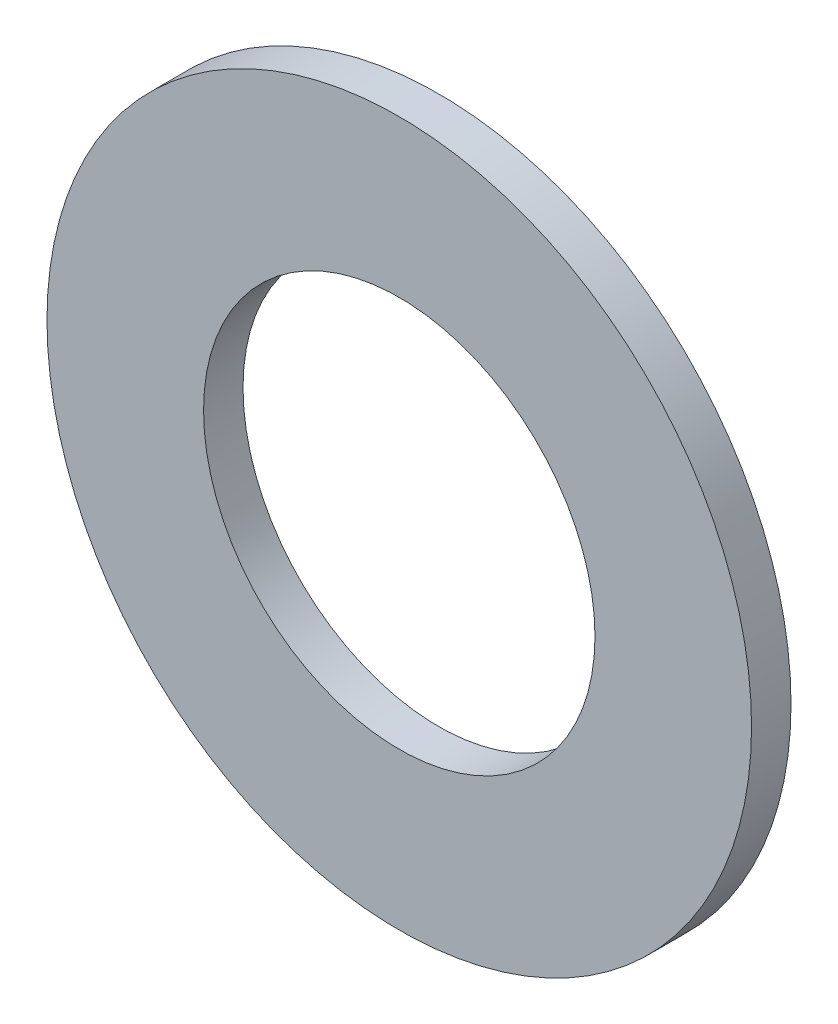
ISO-10303-21;
HEADER;
FILE_DESCRIPTION(('STEP AP214'),'2;1');
FILE_NAME('part.step','',(''),(''),'','','');
FILE_SCHEMA(('AUTOMOTIVE_DESIGN { 1 0 10303 214 1 1 1 1 }'));
ENDSEC;
DATA;
#1=APPLICATION_CONTEXT('core data for automotive mechanical design processes');
#2=APPLICATION_PROTOCOL_DEFINITION('international standard','automotive_design',2000,#1);
#3=PRODUCT_CONTEXT('',#1,'mechanical');
#4=PRODUCT('Part','Part','',(#3));
#5=PRODUCT_RELATED_PRODUCT_CATEGORY('part','',(#4));
#6=PRODUCT_DEFINITION_FORMATION('','',#4);
#7=PRODUCT_DEFINITION_CONTEXT('part definition',#1,'design');
#8=PRODUCT_DEFINITION('design','',#6,#7);
#9=PRODUCT_DEFINITION_SHAPE('','',#8);
#10=(LENGTH_UNIT() NAMED_UNIT(*) SI_UNIT(.MILLI.,.METRE.));
#11=(NAMED_UNIT(*) PLANE_ANGLE_UNIT() SI_UNIT($,.RADIAN.));
#12=(NAMED_UNIT(*) SI_UNIT($,.STERADIAN.) SOLID_ANGLE_UNIT());
#13=UNCERTAINTY_MEASURE_WITH_UNIT(LENGTH_MEASURE(1.E-05),#10,'distance_accuracy_value','');
#14=(GEOMETRIC_REPRESENTATION_CONTEXT(3) GLOBAL_UNCERTAINTY_ASSIGNED_CONTEXT((#13)) GLOBAL_UNIT_ASSIGNED_CONTEXT((#10,
#11,#12)) REPRESENTATION_CONTEXT('',''));
#15=CARTESIAN_POINT('',(0.,0.,0.));
#16=DIRECTION('',(0.,0.,1.));
#17=DIRECTION('',(1.,0.,0.));
#18=AXIS2_PLACEMENT_3D('',#15,#16,#17);
#19=CARTESIAN_POINT('',(0.,0.,-0.800100000000001));
#20=DIRECTION('',(0.,0.,1.));
#21=DIRECTION('',(1.,0.,0.));
#22=AXIS2_PLACEMENT_3D('',#19,#20,#21);
#23=CYLINDRICAL_SURFACE('',#22,14.2875);
#24=CARTESIAN_POINT('',(0.,0.,-0.800100000000001));
#25=DIRECTION('',(0.,0.,1.));
#26=DIRECTION('',(1.,0.,0.));
#27=AXIS2_PLACEMENT_3D('',#24,#25,#26);
#28=CIRCLE('',#27,14.2875);
#29=CARTESIAN_POINT('',(14.2875,0.,-0.800100000000001));
#30=VERTEX_POINT('',#29);
#31=EDGE_CURVE('E10',#30,#30,#28,.T.);
#32=ORIENTED_EDGE('',*,*,#31,.T.);
#33=EDGE_LOOP('',(#32));
#34=FACE_BOUND('',#33,.T.);
#35=CARTESIAN_POINT('',(0.,0.,0.800099999999999));
#36=DIRECTION('',(0.,0.,1.));
#37=DIRECTION('',(1.,0.,0.));
#38=AXIS2_PLACEMENT_3D('',#35,#36,#37);
#39=CIRCLE('',#38,14.2875);
#40=CARTESIAN_POINT('',(14.2875,0.,0.800099999999999));
#41=VERTEX_POINT('',#40);
#42=EDGE_CURVE('E53',#41,#41,#39,.T.);
#43=ORIENTED_EDGE('',*,*,#42,.F.);
#44=EDGE_LOOP('',(#43));
#45=FACE_BOUND('',#44,.T.);
#46=ADVANCED_FACE('F41',(#34,#45),#23,.T.);
#47=CARTESIAN_POINT('',(0.,0.,-0.800100000000001));
#48=DIRECTION('',(0.,0.,1.));
#49=DIRECTION('',(1.,0.,0.));
#50=AXIS2_PLACEMENT_3D('',#47,#48,#49);
#51=PLANE('',#50);
#52=CARTESIAN_POINT('',(0.,0.,-0.800100000000001));
#53=DIRECTION('',(0.,0.,1.));
#54=DIRECTION('',(1.,0.,0.));
#55=AXIS2_PLACEMENT_3D('',#52,#53,#54);
#56=CIRCLE('',#55,7.9375);
#57=CARTESIAN_POINT('',(7.9375,0.,-0.800100000000001));
#58=VERTEX_POINT('',#57);
#59=EDGE_CURVE('E48',#58,#58,#56,.T.);
#60=ORIENTED_EDGE('',*,*,#59,.T.);
#61=EDGE_LOOP('',(#60));
#62=FACE_BOUND('',#61,.T.);
#63=ORIENTED_EDGE('',*,*,#31,.F.);
#64=EDGE_LOOP('',(#63));
#65=FACE_BOUND('',#64,.T.);
#66=ADVANCED_FACE('F74',(#62,#65),#51,.F.);
#67=CARTESIAN_POINT('',(0.,0.,-0.800100000000001));
#68=DIRECTION('',(0.,0.,1.));
#69=DIRECTION('',(1.,0.,0.));
#70=AXIS2_PLACEMENT_3D('',#67,#68,#69);
#71=CYLINDRICAL_SURFACE('',#70,7.9375);
#72=ORIENTED_EDGE('',*,*,#59,.F.);
#73=EDGE_LOOP('',(#72));
#74=FACE_BOUND('',#73,.T.);
#75=CARTESIAN_POINT('',(0.,0.,0.800099999999999));
#76=DIRECTION('',(0.,0.,1.));
#77=DIRECTION('',(1.,0.,0.));
#78=AXIS2_PLACEMENT_3D('',#75,#76,#77);
#79=CIRCLE('',#78,7.9375);
#80=CARTESIAN_POINT('',(7.9375,0.,0.800099999999999));
#81=VERTEX_POINT('',#80);
#82=EDGE_CURVE('E58',#81,#81,#79,.T.);
#83=ORIENTED_EDGE('',*,*,#82,.T.);
#84=EDGE_LOOP('',(#83));
#85=FACE_BOUND('',#84,.T.);
#86=ADVANCED_FACE('F65',(#74,#85),#71,.F.);
#87=CARTESIAN_POINT('',(0.,0.,0.800099999999999));
#88=DIRECTION('',(0.,0.,1.));
#89=DIRECTION('',(1.,0.,0.));
#90=AXIS2_PLACEMENT_3D('',#87,#88,#89);
#91=PLANE('',#90);
#92=ORIENTED_EDGE('',*,*,#42,.T.);
#93=EDGE_LOOP('',(#92));
#94=FACE_BOUND('',#93,.T.);
#95=ORIENTED_EDGE('',*,*,#82,.F.);
#96=EDGE_LOOP('',(#95));
#97=FACE_BOUND('',#96,.T.);
#98=ADVANCED_FACE('F67',(#94,#97),#91,.T.);
#99=CLOSED_SHELL('',(#46,#66,#86,#98));
#100=MANIFOLD_SOLID_BREP('B2',#99);
#101=ADVANCED_BREP_SHAPE_REPRESENTATION('',(#18,#100),#14);
#102=SHAPE_DEFINITION_REPRESENTATION(#9,#101);
ENDSEC;
END-ISO-10303-21;
